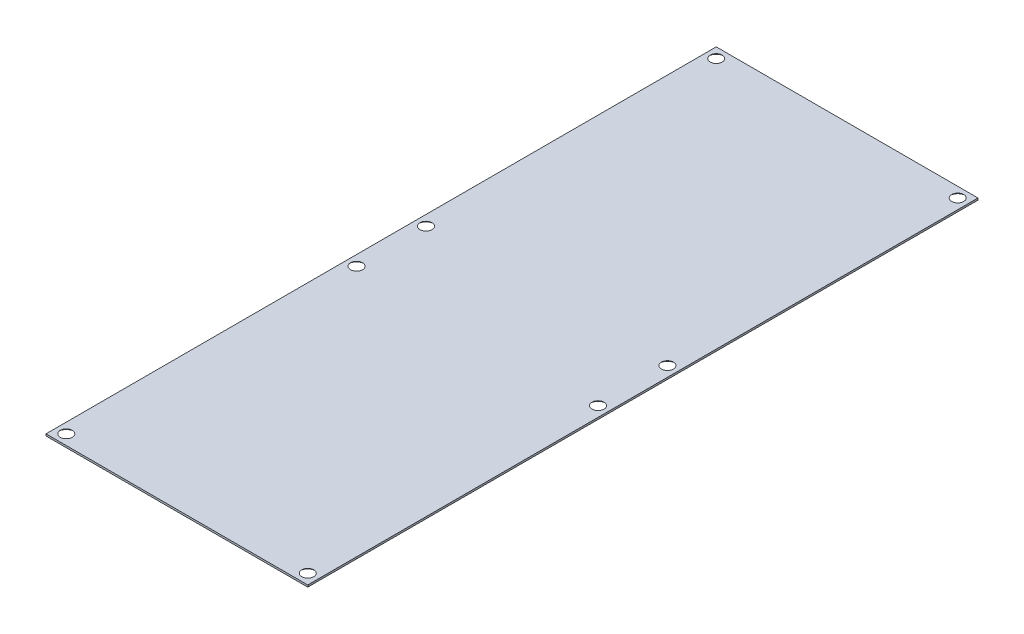
ISO-10303-21;
HEADER;
FILE_DESCRIPTION(('STEP AP214'),'2;1');
FILE_NAME('part.step','',(''),(''),'','','');
FILE_SCHEMA(('AUTOMOTIVE_DESIGN { 1 0 10303 214 1 1 1 1 }'));
ENDSEC;
DATA;
#1=APPLICATION_CONTEXT('core data for automotive mechanical design processes');
#2=APPLICATION_PROTOCOL_DEFINITION('international standard','automotive_design',2000,#1);
#3=PRODUCT_CONTEXT('',#1,'mechanical');
#4=PRODUCT('Part','Part','',(#3));
#5=PRODUCT_RELATED_PRODUCT_CATEGORY('part','',(#4));
#6=PRODUCT_DEFINITION_FORMATION('','',#4);
#7=PRODUCT_DEFINITION_CONTEXT('part definition',#1,'design');
#8=PRODUCT_DEFINITION('design','',#6,#7);
#9=PRODUCT_DEFINITION_SHAPE('','',#8);
#10=(LENGTH_UNIT() NAMED_UNIT(*) SI_UNIT(.MILLI.,.METRE.));
#11=(NAMED_UNIT(*) PLANE_ANGLE_UNIT() SI_UNIT($,.RADIAN.));
#12=(NAMED_UNIT(*) SI_UNIT($,.STERADIAN.) SOLID_ANGLE_UNIT());
#13=UNCERTAINTY_MEASURE_WITH_UNIT(LENGTH_MEASURE(1.E-05),#10,'distance_accuracy_value','');
#14=(GEOMETRIC_REPRESENTATION_CONTEXT(3) GLOBAL_UNCERTAINTY_ASSIGNED_CONTEXT((#13)) GLOBAL_UNIT_ASSIGNED_CONTEXT((#10,
#11,#12)) REPRESENTATION_CONTEXT('',''));
#15=CARTESIAN_POINT('',(0.,0.,0.));
#16=DIRECTION('',(0.,0.,1.));
#17=DIRECTION('',(1.,0.,0.));
#18=AXIS2_PLACEMENT_3D('',#15,#16,#17);
#19=CARTESIAN_POINT('',(50.,-99.8,113.5));
#20=DIRECTION('',(0.,1.,0.));
#21=DIRECTION('',(0.,0.,1.));
#22=AXIS2_PLACEMENT_3D('',#19,#20,#21);
#23=PLANE('',#22);
#24=CARTESIAN_POINT('',(11.9,-99.8,124.45));
#25=DIRECTION('',(0.,1.,0.));
#26=DIRECTION('',(0.,0.,1.));
#27=AXIS2_PLACEMENT_3D('',#24,#25,#26);
#28=CIRCLE('',#27,2.49996925625311);
#29=CARTESIAN_POINT('',(11.9,-99.8,126.949969256253));
#30=VERTEX_POINT('',#29);
#31=EDGE_CURVE('E101',#30,#30,#28,.T.);
#32=ORIENTED_EDGE('',*,*,#31,.T.);
#33=EDGE_LOOP('',(#32));
#34=FACE_BOUND('',#33,.T.);
#35=CARTESIAN_POINT('',(88.1,-99.8,216.05));
#36=DIRECTION('',(0.,1.,0.));
#37=DIRECTION('',(0.,0.,1.));
#38=AXIS2_PLACEMENT_3D('',#35,#36,#37);
#39=CIRCLE('',#38,2.4999692562812);
#40=CARTESIAN_POINT('',(88.1,-99.8,218.549969256281));
#41=VERTEX_POINT('',#40);
#42=EDGE_CURVE('E105',#41,#41,#39,.T.);
#43=ORIENTED_EDGE('',*,*,#42,.T.);
#44=EDGE_LOOP('',(#43));
#45=FACE_BOUND('',#44,.T.);
#46=CARTESIAN_POINT('',(88.1,-99.8,124.45));
#47=DIRECTION('',(0.,1.,0.));
#48=DIRECTION('',(0.,0.,1.));
#49=AXIS2_PLACEMENT_3D('',#46,#47,#48);
#50=CIRCLE('',#49,2.49996925625311);
#51=CARTESIAN_POINT('',(88.1,-99.8,126.949969256253));
#52=VERTEX_POINT('',#51);
#53=EDGE_CURVE('E108',#52,#52,#50,.T.);
#54=ORIENTED_EDGE('',*,*,#53,.T.);
#55=EDGE_LOOP('',(#54));
#56=FACE_BOUND('',#55,.T.);
#57=CARTESIAN_POINT('',(11.9,-99.8,102.55));
#58=DIRECTION('',(0.,1.,0.));
#59=DIRECTION('',(0.,0.,1.));
#60=AXIS2_PLACEMENT_3D('',#57,#58,#59);
#61=CIRCLE('',#60,2.49996925635033);
#62=CARTESIAN_POINT('',(11.9,-99.8,105.04996925635));
#63=VERTEX_POINT('',#62);
#64=EDGE_CURVE('E111',#63,#63,#61,.T.);
#65=ORIENTED_EDGE('',*,*,#64,.T.);
#66=EDGE_LOOP('',(#65));
#67=FACE_BOUND('',#66,.T.);
#68=CARTESIAN_POINT('',(88.1,-99.8,10.95));
#69=DIRECTION('',(0.,1.,0.));
#70=DIRECTION('',(0.,0.,1.));
#71=AXIS2_PLACEMENT_3D('',#68,#69,#70);
#72=CIRCLE('',#71,2.49996925637908);
#73=CARTESIAN_POINT('',(88.1,-99.8,13.4499692563791));
#74=VERTEX_POINT('',#73);
#75=EDGE_CURVE('E114',#74,#74,#72,.T.);
#76=ORIENTED_EDGE('',*,*,#75,.T.);
#77=EDGE_LOOP('',(#76));
#78=FACE_BOUND('',#77,.T.);
#79=CARTESIAN_POINT('',(11.9,-99.8,10.95));
#80=DIRECTION('',(0.,1.,0.));
#81=DIRECTION('',(0.,0.,1.));
#82=AXIS2_PLACEMENT_3D('',#79,#80,#81);
#83=CIRCLE('',#82,2.49996925637908);
#84=CARTESIAN_POINT('',(11.9,-99.8,13.4499692563791));
#85=VERTEX_POINT('',#84);
#86=EDGE_CURVE('E117',#85,#85,#83,.T.);
#87=ORIENTED_EDGE('',*,*,#86,.T.);
#88=EDGE_LOOP('',(#87));
#89=FACE_BOUND('',#88,.T.);
#90=CARTESIAN_POINT('',(88.1,-99.8,102.55));
#91=DIRECTION('',(0.,1.,0.));
#92=DIRECTION('',(0.,0.,1.));
#93=AXIS2_PLACEMENT_3D('',#90,#91,#92);
#94=CIRCLE('',#93,2.49996925635033);
#95=CARTESIAN_POINT('',(88.1,-99.8,105.04996925635));
#96=VERTEX_POINT('',#95);
#97=EDGE_CURVE('E119',#96,#96,#94,.T.);
#98=ORIENTED_EDGE('',*,*,#97,.T.);
#99=EDGE_LOOP('',(#98));
#100=FACE_BOUND('',#99,.T.);
#101=CARTESIAN_POINT('',(11.9,-99.8,216.05));
#102=DIRECTION('',(0.,1.,0.));
#103=DIRECTION('',(0.,0.,1.));
#104=AXIS2_PLACEMENT_3D('',#101,#102,#103);
#105=CIRCLE('',#104,2.49996925633804);
#106=CARTESIAN_POINT('',(11.9,-99.8,218.549969256338));
#107=VERTEX_POINT('',#106);
#108=EDGE_CURVE('E20',#107,#107,#105,.T.);
#109=ORIENTED_EDGE('',*,*,#108,.T.);
#110=EDGE_LOOP('',(#109));
#111=FACE_BOUND('',#110,.T.);
#112=DIRECTION('',(0.,0.,-1.));
#113=VECTOR('',#112,1.);
#114=CARTESIAN_POINT('',(91.3,-99.8,113.5));
#115=LINE('',#114,#113);
#116=CARTESIAN_POINT('',(91.3,-99.8,219.25));
#117=VERTEX_POINT('',#116);
#118=CARTESIAN_POINT('',(91.3,-99.8,7.74999999999999));
#119=VERTEX_POINT('',#118);
#120=EDGE_CURVE('E69',#117,#119,#115,.T.);
#121=ORIENTED_EDGE('',*,*,#120,.F.);
#122=DIRECTION('',(1.,0.,0.));
#123=VECTOR('',#122,1.);
#124=CARTESIAN_POINT('',(50.,-99.8,219.25));
#125=LINE('',#124,#123);
#126=CARTESIAN_POINT('',(8.7,-99.8,219.25));
#127=VERTEX_POINT('',#126);
#128=EDGE_CURVE('E60',#127,#117,#125,.T.);
#129=ORIENTED_EDGE('',*,*,#128,.F.);
#130=DIRECTION('',(0.,0.,-1.));
#131=VECTOR('',#130,1.);
#132=CARTESIAN_POINT('',(8.7,-99.8,113.5));
#133=LINE('',#132,#131);
#134=CARTESIAN_POINT('',(8.7,-99.8,7.74999999999999));
#135=VERTEX_POINT('',#134);
#136=EDGE_CURVE('E126',#127,#135,#133,.T.);
#137=ORIENTED_EDGE('',*,*,#136,.T.);
#138=DIRECTION('',(1.,0.,0.));
#139=VECTOR('',#138,1.);
#140=CARTESIAN_POINT('',(50.,-99.8,7.75));
#141=LINE('',#140,#139);
#142=EDGE_CURVE('E55',#135,#119,#141,.T.);
#143=ORIENTED_EDGE('',*,*,#142,.T.);
#144=EDGE_LOOP('',(#121,#129,#137,#143));
#145=FACE_BOUND('',#144,.T.);
#146=ADVANCED_FACE('F17',(#34,#45,#56,#67,#78,#89,#100,#111,#145),#23,.F.);
#147=CARTESIAN_POINT('',(50.,-99.5,219.25));
#148=DIRECTION('',(0.,0.,1.));
#149=DIRECTION('',(1.,0.,0.));
#150=AXIS2_PLACEMENT_3D('',#147,#148,#149);
#151=PLANE('',#150);
#152=DIRECTION('',(0.,1.,0.));
#153=VECTOR('',#152,1.);
#154=CARTESIAN_POINT('',(91.3,-99.5,219.25));
#155=LINE('',#154,#153);
#156=CARTESIAN_POINT('',(91.3,-99.2,219.25));
#157=VERTEX_POINT('',#156);
#158=EDGE_CURVE('E63',#157,#117,#155,.F.);
#159=ORIENTED_EDGE('',*,*,#158,.F.);
#160=DIRECTION('',(1.,0.,0.));
#161=VECTOR('',#160,1.);
#162=CARTESIAN_POINT('',(50.,-99.2,219.25));
#163=LINE('',#162,#161);
#164=CARTESIAN_POINT('',(8.7,-99.2,219.25));
#165=VERTEX_POINT('',#164);
#166=EDGE_CURVE('E104',#165,#157,#163,.T.);
#167=ORIENTED_EDGE('',*,*,#166,.F.);
#168=DIRECTION('',(0.,1.,0.));
#169=VECTOR('',#168,1.);
#170=CARTESIAN_POINT('',(8.7,-99.5,219.25));
#171=LINE('',#170,#169);
#172=EDGE_CURVE('E66',#165,#127,#171,.F.);
#173=ORIENTED_EDGE('',*,*,#172,.T.);
#174=ORIENTED_EDGE('',*,*,#128,.T.);
#175=EDGE_LOOP('',(#159,#167,#173,#174));
#176=FACE_BOUND('',#175,.T.);
#177=ADVANCED_FACE('F61',(#176),#151,.T.);
#178=CARTESIAN_POINT('',(91.3,-99.5,113.5));
#179=DIRECTION('',(1.,0.,0.));
#180=DIRECTION('',(0.,0.,-1.));
#181=AXIS2_PLACEMENT_3D('',#178,#179,#180);
#182=PLANE('',#181);
#183=DIRECTION('',(0.,1.,0.));
#184=VECTOR('',#183,1.);
#185=CARTESIAN_POINT('',(91.3,-99.5,7.75));
#186=LINE('',#185,#184);
#187=CARTESIAN_POINT('',(91.3,-99.2,7.74999999999999));
#188=VERTEX_POINT('',#187);
#189=EDGE_CURVE('E133',#119,#188,#186,.T.);
#190=ORIENTED_EDGE('',*,*,#189,.T.);
#191=DIRECTION('',(0.,0.,1.));
#192=VECTOR('',#191,1.);
#193=CARTESIAN_POINT('',(91.3,-99.2,113.5));
#194=LINE('',#193,#192);
#195=EDGE_CURVE('E75',#157,#188,#194,.F.);
#196=ORIENTED_EDGE('',*,*,#195,.F.);
#197=ORIENTED_EDGE('',*,*,#158,.T.);
#198=ORIENTED_EDGE('',*,*,#120,.T.);
#199=EDGE_LOOP('',(#190,#196,#197,#198));
#200=FACE_BOUND('',#199,.T.);
#201=ADVANCED_FACE('F73',(#200),#182,.T.);
#202=CARTESIAN_POINT('',(50.,-99.5,7.75));
#203=DIRECTION('',(0.,0.,1.));
#204=DIRECTION('',(1.,0.,0.));
#205=AXIS2_PLACEMENT_3D('',#202,#203,#204);
#206=PLANE('',#205);
#207=ORIENTED_EDGE('',*,*,#142,.F.);
#208=DIRECTION('',(0.,1.,0.));
#209=VECTOR('',#208,1.);
#210=CARTESIAN_POINT('',(8.7,-99.5,7.74999999999999));
#211=LINE('',#210,#209);
#212=CARTESIAN_POINT('',(8.7,-99.2,7.75));
#213=VERTEX_POINT('',#212);
#214=EDGE_CURVE('E35',#135,#213,#211,.T.);
#215=ORIENTED_EDGE('',*,*,#214,.T.);
#216=DIRECTION('',(1.,0.,0.));
#217=VECTOR('',#216,1.);
#218=CARTESIAN_POINT('',(50.,-99.2,7.74999999999999));
#219=LINE('',#218,#217);
#220=EDGE_CURVE('E135',#188,#213,#219,.F.);
#221=ORIENTED_EDGE('',*,*,#220,.F.);
#222=ORIENTED_EDGE('',*,*,#189,.F.);
#223=EDGE_LOOP('',(#207,#215,#221,#222));
#224=FACE_BOUND('',#223,.T.);
#225=ADVANCED_FACE('F136',(#224),#206,.F.);
#226=CARTESIAN_POINT('',(8.7,-99.5,113.5));
#227=DIRECTION('',(1.,0.,0.));
#228=DIRECTION('',(0.,0.,-1.));
#229=AXIS2_PLACEMENT_3D('',#226,#227,#228);
#230=PLANE('',#229);
#231=ORIENTED_EDGE('',*,*,#136,.F.);
#232=ORIENTED_EDGE('',*,*,#172,.F.);
#233=DIRECTION('',(0.,0.,1.));
#234=VECTOR('',#233,1.);
#235=CARTESIAN_POINT('',(8.7,-99.2,113.5));
#236=LINE('',#235,#234);
#237=EDGE_CURVE('E100',#213,#165,#236,.T.);
#238=ORIENTED_EDGE('',*,*,#237,.F.);
#239=ORIENTED_EDGE('',*,*,#214,.F.);
#240=EDGE_LOOP('',(#231,#232,#238,#239));
#241=FACE_BOUND('',#240,.T.);
#242=ADVANCED_FACE('F143',(#241),#230,.F.);
#243=CARTESIAN_POINT('',(11.9,-99.8000100743184,216.05));
#244=DIRECTION('',(0.,-1.,0.));
#245=DIRECTION('',(0.,0.,-1.));
#246=AXIS2_PLACEMENT_3D('',#243,#244,#245);
#247=CONICAL_SURFACE('',#246,2.49997933053253,0.785392014615523);
#248=CARTESIAN_POINT('',(11.9,-99.200000000053,216.05));
#249=DIRECTION('',(0.,-1.,0.));
#250=DIRECTION('',(0.,0.,-1.));
#251=AXIS2_PLACEMENT_3D('',#248,#249,#250);
#252=CIRCLE('',#251,1.89997663482716);
#253=CARTESIAN_POINT('',(11.9,-99.200000000053,214.150023365173));
#254=VERTEX_POINT('',#253);
#255=EDGE_CURVE('E97',#254,#254,#252,.T.);
#256=ORIENTED_EDGE('',*,*,#255,.F.);
#257=EDGE_LOOP('',(#256));
#258=FACE_BOUND('',#257,.T.);
#259=ORIENTED_EDGE('',*,*,#108,.F.);
#260=EDGE_LOOP('',(#259));
#261=FACE_BOUND('',#260,.T.);
#262=ADVANCED_FACE('F145',(#258,#261),#247,.F.);
#263=CARTESIAN_POINT('',(88.1,-99.8000100742615,102.55));
#264=DIRECTION('',(0.,-1.,0.));
#265=DIRECTION('',(0.,0.,-1.));
#266=AXIS2_PLACEMENT_3D('',#263,#264,#265);
#267=CONICAL_SURFACE('',#266,2.49997933048798,0.785392014662893);
#268=CARTESIAN_POINT('',(88.1,-99.1999999999962,102.55));
#269=DIRECTION('',(0.,-1.,0.));
#270=DIRECTION('',(0.,0.,-1.));
#271=AXIS2_PLACEMENT_3D('',#268,#269,#270);
#272=CIRCLE('',#271,1.89997663478261);
#273=CARTESIAN_POINT('',(88.1,-99.1999999999962,100.650023365217));
#274=VERTEX_POINT('',#273);
#275=EDGE_CURVE('E94',#274,#274,#272,.T.);
#276=ORIENTED_EDGE('',*,*,#275,.F.);
#277=EDGE_LOOP('',(#276));
#278=FACE_BOUND('',#277,.T.);
#279=ORIENTED_EDGE('',*,*,#97,.F.);
#280=EDGE_LOOP('',(#279));
#281=FACE_BOUND('',#280,.T.);
#282=ADVANCED_FACE('F152',(#278,#281),#267,.F.);
#283=CARTESIAN_POINT('',(11.9,-99.8000100741478,10.95));
#284=DIRECTION('',(0.,-1.,0.));
#285=DIRECTION('',(0.,0.,-1.));
#286=AXIS2_PLACEMENT_3D('',#283,#284,#285);
#287=CONICAL_SURFACE('',#286,2.49997933040304,0.785392014662893);
#288=CARTESIAN_POINT('',(11.9,-99.1999999999962,10.95));
#289=DIRECTION('',(0.,-1.,0.));
#290=DIRECTION('',(0.,0.,-1.));
#291=AXIS2_PLACEMENT_3D('',#288,#289,#290);
#292=CIRCLE('',#291,1.89997663481135);
#293=CARTESIAN_POINT('',(11.9,-99.1999999999962,9.05002336518865));
#294=VERTEX_POINT('',#293);
#295=EDGE_CURVE('E91',#294,#294,#292,.T.);
#296=ORIENTED_EDGE('',*,*,#295,.F.);
#297=EDGE_LOOP('',(#296));
#298=FACE_BOUND('',#297,.T.);
#299=ORIENTED_EDGE('',*,*,#86,.F.);
#300=EDGE_LOOP('',(#299));
#301=FACE_BOUND('',#300,.T.);
#302=ADVANCED_FACE('F182',(#298,#301),#287,.F.);
#303=CARTESIAN_POINT('',(88.1,-99.8000100741478,10.95));
#304=DIRECTION('',(0.,-1.,0.));
#305=DIRECTION('',(0.,0.,-1.));
#306=AXIS2_PLACEMENT_3D('',#303,#304,#305);
#307=CONICAL_SURFACE('',#306,2.49997933040304,0.785392014662893);
#308=CARTESIAN_POINT('',(88.1,-99.1999999999962,10.95));
#309=DIRECTION('',(0.,-1.,0.));
#310=DIRECTION('',(0.,0.,-1.));
#311=AXIS2_PLACEMENT_3D('',#308,#309,#310);
#312=CIRCLE('',#311,1.89997663481135);
#313=CARTESIAN_POINT('',(88.1,-99.1999999999962,9.05002336518865));
#314=VERTEX_POINT('',#313);
#315=EDGE_CURVE('E88',#314,#314,#312,.T.);
#316=ORIENTED_EDGE('',*,*,#315,.F.);
#317=EDGE_LOOP('',(#316));
#318=FACE_BOUND('',#317,.T.);
#319=ORIENTED_EDGE('',*,*,#75,.F.);
#320=EDGE_LOOP('',(#319));
#321=FACE_BOUND('',#320,.T.);
#322=ADVANCED_FACE('F178',(#318,#321),#307,.F.);
#323=CARTESIAN_POINT('',(11.9,-99.8000100742615,102.55));
#324=DIRECTION('',(0.,-1.,0.));
#325=DIRECTION('',(0.,0.,-1.));
#326=AXIS2_PLACEMENT_3D('',#323,#324,#325);
#327=CONICAL_SURFACE('',#326,2.49997933048798,0.785392014662893);
#328=CARTESIAN_POINT('',(11.9,-99.1999999999962,102.55));
#329=DIRECTION('',(0.,-1.,0.));
#330=DIRECTION('',(0.,0.,-1.));
#331=AXIS2_PLACEMENT_3D('',#328,#329,#330);
#332=CIRCLE('',#331,1.89997663478261);
#333=CARTESIAN_POINT('',(11.9,-99.1999999999962,100.650023365217));
#334=VERTEX_POINT('',#333);
#335=EDGE_CURVE('E85',#334,#334,#332,.T.);
#336=ORIENTED_EDGE('',*,*,#335,.F.);
#337=EDGE_LOOP('',(#336));
#338=FACE_BOUND('',#337,.T.);
#339=ORIENTED_EDGE('',*,*,#64,.F.);
#340=EDGE_LOOP('',(#339));
#341=FACE_BOUND('',#340,.T.);
#342=ADVANCED_FACE('F174',(#338,#341),#327,.F.);
#343=CARTESIAN_POINT('',(88.1,-99.8000100743184,124.45));
#344=DIRECTION('',(0.,-1.,0.));
#345=DIRECTION('',(0.,0.,-1.));
#346=AXIS2_PLACEMENT_3D('',#343,#344,#345);
#347=CONICAL_SURFACE('',#346,2.4999793304476,0.785392014662894);
#348=CARTESIAN_POINT('',(88.1,-99.200000000053,124.45));
#349=DIRECTION('',(0.,-1.,0.));
#350=DIRECTION('',(0.,0.,-1.));
#351=AXIS2_PLACEMENT_3D('',#348,#349,#350);
#352=CIRCLE('',#351,1.89997663474223);
#353=CARTESIAN_POINT('',(88.1,-99.200000000053,122.550023365258));
#354=VERTEX_POINT('',#353);
#355=EDGE_CURVE('E82',#354,#354,#352,.T.);
#356=ORIENTED_EDGE('',*,*,#355,.F.);
#357=EDGE_LOOP('',(#356));
#358=FACE_BOUND('',#357,.T.);
#359=ORIENTED_EDGE('',*,*,#53,.F.);
#360=EDGE_LOOP('',(#359));
#361=FACE_BOUND('',#360,.T.);
#362=ADVANCED_FACE('F170',(#358,#361),#347,.F.);
#363=CARTESIAN_POINT('',(88.1,-99.8000100743184,216.05));
#364=DIRECTION('',(0.,-1.,0.));
#365=DIRECTION('',(0.,0.,-1.));
#366=AXIS2_PLACEMENT_3D('',#363,#364,#365);
#367=CONICAL_SURFACE('',#366,2.49997933047569,0.785392014615525);
#368=CARTESIAN_POINT('',(88.1,-99.200000000053,216.05));
#369=DIRECTION('',(0.,-1.,0.));
#370=DIRECTION('',(0.,0.,-1.));
#371=AXIS2_PLACEMENT_3D('',#368,#369,#370);
#372=CIRCLE('',#371,1.89997663482716);
#373=CARTESIAN_POINT('',(88.1,-99.200000000053,214.150023365173));
#374=VERTEX_POINT('',#373);
#375=EDGE_CURVE('E26',#374,#374,#372,.T.);
#376=ORIENTED_EDGE('',*,*,#375,.F.);
#377=EDGE_LOOP('',(#376));
#378=FACE_BOUND('',#377,.T.);
#379=ORIENTED_EDGE('',*,*,#42,.F.);
#380=EDGE_LOOP('',(#379));
#381=FACE_BOUND('',#380,.T.);
#382=ADVANCED_FACE('F163',(#378,#381),#367,.F.);
#383=CARTESIAN_POINT('',(11.9,-99.8000100743184,124.45));
#384=DIRECTION('',(0.,-1.,0.));
#385=DIRECTION('',(0.,0.,-1.));
#386=AXIS2_PLACEMENT_3D('',#383,#384,#385);
#387=CONICAL_SURFACE('',#386,2.4999793304476,0.785392014662894);
#388=CARTESIAN_POINT('',(11.9,-99.200000000053,124.45));
#389=DIRECTION('',(0.,-1.,0.));
#390=DIRECTION('',(0.,0.,-1.));
#391=AXIS2_PLACEMENT_3D('',#388,#389,#390);
#392=CIRCLE('',#391,1.89997663474223);
#393=CARTESIAN_POINT('',(11.9,-99.200000000053,122.550023365258));
#394=VERTEX_POINT('',#393);
#395=EDGE_CURVE('E11',#394,#394,#392,.T.);
#396=ORIENTED_EDGE('',*,*,#395,.F.);
#397=EDGE_LOOP('',(#396));
#398=FACE_BOUND('',#397,.T.);
#399=ORIENTED_EDGE('',*,*,#31,.F.);
#400=EDGE_LOOP('',(#399));
#401=FACE_BOUND('',#400,.T.);
#402=ADVANCED_FACE('F157',(#398,#401),#387,.F.);
#403=CARTESIAN_POINT('',(50.,-99.2,113.5));
#404=DIRECTION('',(0.,1.,0.));
#405=DIRECTION('',(0.,0.,1.));
#406=AXIS2_PLACEMENT_3D('',#403,#404,#405);
#407=PLANE('',#406);
#408=ORIENTED_EDGE('',*,*,#395,.T.);
#409=EDGE_LOOP('',(#408));
#410=FACE_BOUND('',#409,.T.);
#411=ORIENTED_EDGE('',*,*,#375,.T.);
#412=EDGE_LOOP('',(#411));
#413=FACE_BOUND('',#412,.T.);
#414=ORIENTED_EDGE('',*,*,#355,.T.);
#415=EDGE_LOOP('',(#414));
#416=FACE_BOUND('',#415,.T.);
#417=ORIENTED_EDGE('',*,*,#335,.T.);
#418=EDGE_LOOP('',(#417));
#419=FACE_BOUND('',#418,.T.);
#420=ORIENTED_EDGE('',*,*,#315,.T.);
#421=EDGE_LOOP('',(#420));
#422=FACE_BOUND('',#421,.T.);
#423=ORIENTED_EDGE('',*,*,#295,.T.);
#424=EDGE_LOOP('',(#423));
#425=FACE_BOUND('',#424,.T.);
#426=ORIENTED_EDGE('',*,*,#275,.T.);
#427=EDGE_LOOP('',(#426));
#428=FACE_BOUND('',#427,.T.);
#429=ORIENTED_EDGE('',*,*,#255,.T.);
#430=EDGE_LOOP('',(#429));
#431=FACE_BOUND('',#430,.T.);
#432=ORIENTED_EDGE('',*,*,#220,.T.);
#433=ORIENTED_EDGE('',*,*,#237,.T.);
#434=ORIENTED_EDGE('',*,*,#166,.T.);
#435=ORIENTED_EDGE('',*,*,#195,.T.);
#436=EDGE_LOOP('',(#432,#433,#434,#435));
#437=FACE_BOUND('',#436,.T.);
#438=ADVANCED_FACE('F140',(#410,#413,#416,#419,#422,#425,#428,#431,#437),#407,.T.);
#439=CLOSED_SHELL('',(#146,#177,#201,#225,#242,#262,#282,#302,#322,#342,#362,#382,#402,#438));
#440=MANIFOLD_SOLID_BREP('B1',#439);
#441=ADVANCED_BREP_SHAPE_REPRESENTATION('',(#18,#440),#14);
#442=SHAPE_DEFINITION_REPRESENTATION(#9,#441);
ENDSEC;
END-ISO-10303-21;
